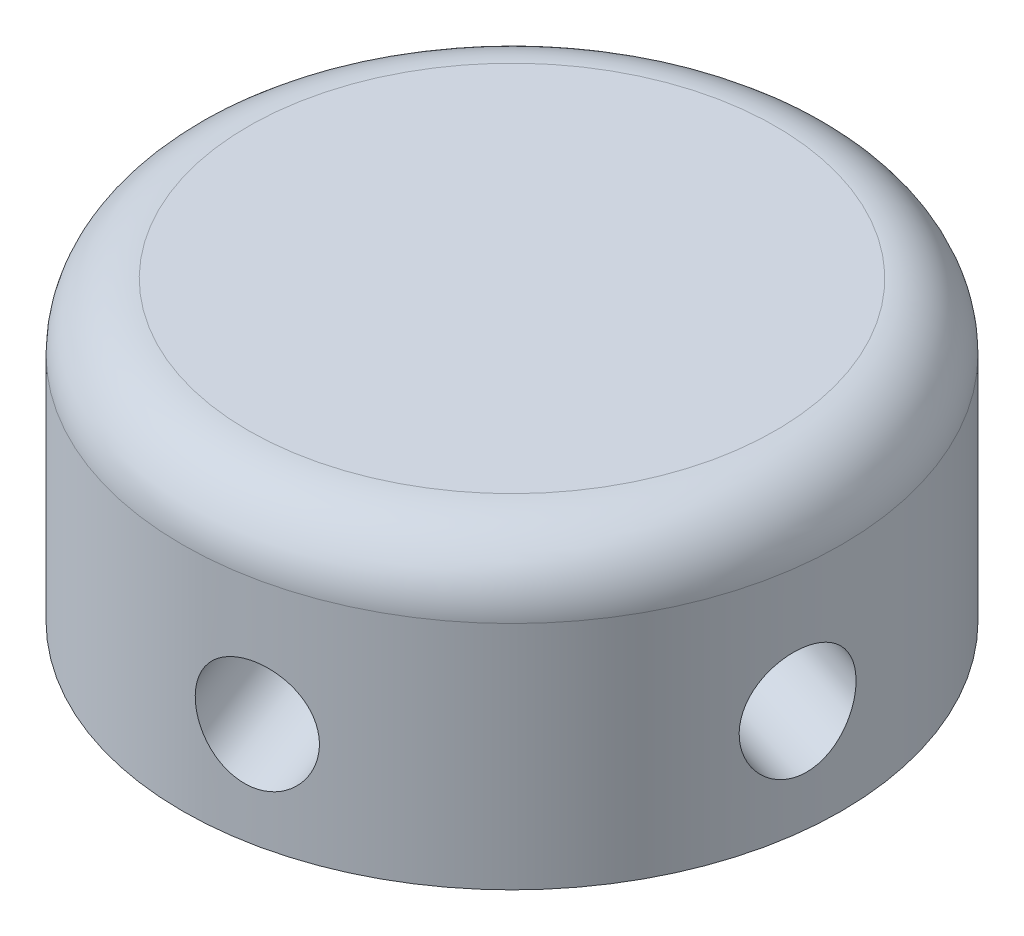
ISO-10303-21;
HEADER;
FILE_DESCRIPTION(('STEP AP214'),'2;1');
FILE_NAME('part.step','',(''),(''),'','','');
FILE_SCHEMA(('AUTOMOTIVE_DESIGN { 1 0 10303 214 1 1 1 1 }'));
ENDSEC;
DATA;
#1=APPLICATION_CONTEXT('core data for automotive mechanical design processes');
#2=APPLICATION_PROTOCOL_DEFINITION('international standard','automotive_design',2000,#1);
#3=PRODUCT_CONTEXT('',#1,'mechanical');
#4=PRODUCT('Part','Part','',(#3));
#5=PRODUCT_RELATED_PRODUCT_CATEGORY('part','',(#4));
#6=PRODUCT_DEFINITION_FORMATION('','',#4);
#7=PRODUCT_DEFINITION_CONTEXT('part definition',#1,'design');
#8=PRODUCT_DEFINITION('design','',#6,#7);
#9=PRODUCT_DEFINITION_SHAPE('','',#8);
#10=(LENGTH_UNIT() NAMED_UNIT(*) SI_UNIT(.MILLI.,.METRE.));
#11=(NAMED_UNIT(*) PLANE_ANGLE_UNIT() SI_UNIT($,.RADIAN.));
#12=(NAMED_UNIT(*) SI_UNIT($,.STERADIAN.) SOLID_ANGLE_UNIT());
#13=UNCERTAINTY_MEASURE_WITH_UNIT(LENGTH_MEASURE(1.E-05),#10,'distance_accuracy_value','');
#14=(GEOMETRIC_REPRESENTATION_CONTEXT(3) GLOBAL_UNCERTAINTY_ASSIGNED_CONTEXT((#13)) GLOBAL_UNIT_ASSIGNED_CONTEXT((#10,
#11,#12)) REPRESENTATION_CONTEXT('',''));
#15=CARTESIAN_POINT('',(0.,0.,0.));
#16=DIRECTION('',(0.,0.,1.));
#17=DIRECTION('',(1.,0.,0.));
#18=AXIS2_PLACEMENT_3D('',#15,#16,#17);
#19=CARTESIAN_POINT('',(0.,-6.,0.));
#20=DIRECTION('',(0.,1.,0.));
#21=DIRECTION('',(0.,0.,1.));
#22=AXIS2_PLACEMENT_3D('',#19,#20,#21);
#23=CYLINDRICAL_SURFACE('',#22,10.);
#24=CARTESIAN_POINT('',(0.,1.,0.));
#25=DIRECTION('',(0.,1.,0.));
#26=DIRECTION('',(0.,0.,1.));
#27=AXIS2_PLACEMENT_3D('',#24,#25,#26);
#28=CIRCLE('',#27,10.);
#29=CARTESIAN_POINT('',(0.,1.,10.));
#30=VERTEX_POINT('',#29);
#31=EDGE_CURVE('E10',#30,#30,#28,.F.);
#32=ORIENTED_EDGE('',*,*,#31,.T.);
#33=EDGE_LOOP('',(#32));
#34=FACE_BOUND('',#33,.T.);
#35=CARTESIAN_POINT('',(-6.18040658631982,-2.80419257592395,-7.8614613417465));
#36=CARTESIAN_POINT('',(-6.18041069378116,-2.90234784309518,-7.86145985033207));
#37=CARTESIAN_POINT('',(-6.18709037837394,-3.00057569421897,-7.85622071906424));
#38=CARTESIAN_POINT('',(-6.21328313433534,-3.19429375623175,-7.83552031582612));
#39=CARTESIAN_POINT('',(-6.23281569685475,-3.28977957900091,-7.82004351843738));
#40=CARTESIAN_POINT('',(-6.28376502842835,-3.47517276967888,-7.77916181257504));
#41=CARTESIAN_POINT('',(-6.31516706385408,-3.56508689335964,-7.75376921134334));
#42=CARTESIAN_POINT('',(-6.38865971296323,-3.73693258914234,-7.69332712533847));
#43=CARTESIAN_POINT('',(-6.4307480948599,-3.81886582307326,-7.65827965680337));
#44=CARTESIAN_POINT('',(-6.52448986893661,-3.97278415857681,-7.5785772815116));
#45=CARTESIAN_POINT('',(-6.57620342226979,-4.04470142029659,-7.53386164380033));
#46=CARTESIAN_POINT('',(-6.68725447470501,-4.17534392326118,-7.43546314485651));
#47=CARTESIAN_POINT('',(-6.74659001159406,-4.23407254914793,-7.38178259049963));
#48=CARTESIAN_POINT('',(-6.86747316238743,-4.33309816932697,-7.26940523116863));
#49=CARTESIAN_POINT('',(-6.92874101682425,-4.37420107240322,-7.21111983965897));
#50=CARTESIAN_POINT('',(-7.05399457373656,-4.44028699170343,-7.08863909005609));
#51=CARTESIAN_POINT('',(-7.1179783887015,-4.46528101377072,-7.02444780130276));
#52=CARTESIAN_POINT('',(-7.2408979989159,-4.4964619358335,-6.8975752553002));
#53=CARTESIAN_POINT('',(-7.2998114016746,-4.50403920222909,-6.835211852897));
#54=CARTESIAN_POINT('',(-7.41599656463583,-4.50415740699111,-6.70897494081218));
#55=CARTESIAN_POINT('',(-7.47326875792584,-4.49670234989006,-6.64510183778663));
#56=CARTESIAN_POINT('',(-7.58217917913624,-4.46774917979113,-6.52051620708892));
#57=CARTESIAN_POINT('',(-7.63395240425703,-4.44684381033082,-6.45978210248453));
#58=CARTESIAN_POINT('',(-7.73327325732892,-4.39246364343792,-6.34054506008151));
#59=CARTESIAN_POINT('',(-7.78082040703957,-4.35898742566933,-6.28204237522627));
#60=CARTESIAN_POINT('',(-7.87234067780815,-4.27943950635112,-6.1669959074082));
#61=CARTESIAN_POINT('',(-7.91614456968675,-4.23298937226029,-6.11058005058202));
#62=CARTESIAN_POINT('',(-7.99779809730484,-4.12962391405995,-6.00331398885442));
#63=CARTESIAN_POINT('',(-8.03564580230697,-4.0727052094075,-5.95246559029986));
#64=CARTESIAN_POINT('',(-8.10775604691805,-3.94529584290214,-5.85391396776607));
#65=CARTESIAN_POINT('',(-8.14151429694982,-3.87409566698231,-5.80675887231004));
#66=CARTESIAN_POINT('',(-8.20153607142322,-3.7234916320388,-5.72167140512811));
#67=CARTESIAN_POINT('',(-8.22779684344153,-3.64408477476704,-5.68374242118406));
#68=CARTESIAN_POINT('',(-8.27416487683236,-3.47360706993731,-5.61604816884507));
#69=CARTESIAN_POINT('',(-8.29374975039458,-3.38211206928312,-5.58698947660017));
#70=CARTESIAN_POINT('',(-8.32405447795391,-3.19457090082377,-5.54173833167562));
#71=CARTESIAN_POINT('',(-8.33477322064973,-3.09852416408824,-5.52554749189225));
#72=CARTESIAN_POINT('',(-8.34721005269621,-2.9032972349777,-5.50674303326532));
#73=CARTESIAN_POINT('',(-8.3488141503021,-2.80409289685924,-5.50430137103277));
#74=CARTESIAN_POINT('',(-8.34248086251898,-2.60668729118917,-5.51389588691072));
#75=CARTESIAN_POINT('',(-8.33454554272457,-2.50848581112888,-5.52592893077623));
#76=CARTESIAN_POINT('',(-8.30942286587974,-2.31961542955216,-5.56362998091201));
#77=CARTESIAN_POINT('',(-8.29257179549985,-2.22880300805648,-5.58880197157573));
#78=CARTESIAN_POINT('',(-8.24983112683427,-2.05390062311326,-5.65170093491985));
#79=CARTESIAN_POINT('',(-8.2239437144287,-1.96980903994349,-5.68942487119679));
#80=CARTESIAN_POINT('',(-8.16459239437144,-1.81433058777238,-5.77425211059514));
#81=CARTESIAN_POINT('',(-8.13148151790137,-1.74256485669541,-5.82090888833601));
#82=CARTESIAN_POINT('',(-8.05758249695944,-1.60987893076595,-5.92277904761302));
#83=CARTESIAN_POINT('',(-8.01679522194457,-1.54895750916636,-5.97799145998169));
#84=CARTESIAN_POINT('',(-7.9291356931972,-1.44084866104323,-6.09376440834493));
#85=CARTESIAN_POINT('',(-7.88240129647873,-1.39341115377824,-6.15419605110393));
#86=CARTESIAN_POINT('',(-7.78316118923601,-1.31197818446462,-6.27923276033472));
#87=CARTESIAN_POINT('',(-7.73065563818385,-1.27798235110665,-6.34383771146675));
#88=CARTESIAN_POINT('',(-7.62126393920933,-1.22444215000392,-6.47484261923763));
#89=CARTESIAN_POINT('',(-7.56439461267379,-1.20484509181928,-6.54123510023709));
#90=CARTESIAN_POINT('',(-7.44753128648001,-1.18040665367519,-6.67398645668238));
#91=CARTESIAN_POINT('',(-7.38753727259583,-1.17556534090098,-6.74034533197383));
#92=CARTESIAN_POINT('',(-7.26603697545491,-1.18076540289665,-6.87114840534427));
#93=CARTESIAN_POINT('',(-7.20452970867928,-1.1908167224365,-6.93559129467686));
#94=CARTESIAN_POINT('',(-7.08188582181877,-1.22556046932424,-7.06077720898353));
#95=CARTESIAN_POINT('',(-7.02074920150364,-1.25025288757539,-7.12152023625636));
#96=CARTESIAN_POINT('',(-6.90082161745449,-1.31362986693059,-7.23779262794899));
#97=CARTESIAN_POINT('',(-6.84203053304105,-1.3523137071329,-7.29332226080096));
#98=CARTESIAN_POINT('',(-6.72880950003165,-1.4426321301286,-7.39790984547475));
#99=CARTESIAN_POINT('',(-6.67437928718441,-1.49426592742231,-7.44696818954728));
#100=CARTESIAN_POINT('',(-6.57186287088399,-1.60901583583468,-7.53759282097776));
#101=CARTESIAN_POINT('',(-6.52377217819324,-1.67212374556233,-7.57916441768701));
#102=CARTESIAN_POINT('',(-6.43563400862007,-1.80807329481835,-7.65414747741365));
#103=CARTESIAN_POINT('',(-6.39558808462159,-1.88091680910276,-7.68755736524249));
#104=CARTESIAN_POINT('',(-6.32481099983414,-2.03460274266089,-7.74589484926247));
#105=CARTESIAN_POINT('',(-6.29412611305473,-2.11548235994557,-7.77078037939385));
#106=CARTESIAN_POINT('',(-6.24337632993539,-2.2825764910716,-7.8116145758641));
#107=CARTESIAN_POINT('',(-6.22330160238461,-2.36878598329015,-7.82757151610482));
#108=CARTESIAN_POINT('',(-6.19932412581324,-2.51357139572223,-7.84656075943516));
#109=CARTESIAN_POINT('',(-6.19222425836726,-2.57131759117338,-7.85215871739794));
#110=CARTESIAN_POINT('',(-6.18276429226737,-2.68743149130231,-7.85960943208847));
#111=CARTESIAN_POINT('',(-6.18040414275684,-2.74579918930468,-7.86146222900137));
#112=CARTESIAN_POINT('',(-6.18040658631982,-2.80419257592395,-7.8614613417465));
#113=B_SPLINE_CURVE_WITH_KNOTS('',3,(#35,#36,#37,#38,#39,#40,#41,#42,#43,#44,#45,#46,#47,#48,
#49,#50,#51,#52,#53,#54,#55,#56,#57,#58,#59,#60,#61,#62,#63,#64,#65,#66,#67,#68,#69,#70,#71,#72,
#73,#74,#75,#76,#77,#78,#79,#80,#81,#82,#83,#84,#85,#86,#87,#88,#89,#90,#91,#92,#93,#94,#95,#96,
#97,#98,#99,#100,#101,#102,#103,#104,#105,#106,#107,#108,#109,#110,#111,#112),.UNSPECIFIED.,.T.,
.F.,(4,2,2,2,2,2,2,2,2,2,2,2,2,2,2,2,2,2,2,2,2,2,2,2,2,2,2,2,2,2,2,2,2,2,2,2,2,2,4),(0.,
0.294247369480007,0.588941991186979,0.883272002128368,1.17754059429731,1.47371432417628,
1.76981195895846,2.05036159735739,2.33071935602934,2.58777759553048,2.84476736510533,
3.091142592679,3.33754566570429,3.59206194690359,3.84666056204866,4.12096676141902,
4.39537353311392,4.6879442991612,4.98055173114879,5.27681071896179,5.57300556860702,
5.85875072810492,6.1444268140438,6.41842323334606,6.69238863746758,6.9608803249332,
7.22936459513529,7.49686142113619,7.76435946509044,8.0320362152438,8.29971279908588,
8.56737559297647,8.83502215529133,9.10247815769814,9.36998573770895,9.63879501418435,
9.90735477750061,10.0824068686198,10.2574570814401),.UNSPECIFIED.);
#114=CARTESIAN_POINT('',(-6.18040658631982,-2.80419257592395,-7.8614613417465));
#115=VERTEX_POINT('',#114);
#116=EDGE_CURVE('E49',#115,#115,#113,.T.);
#117=ORIENTED_EDGE('',*,*,#116,.F.);
#118=EDGE_LOOP('',(#117));
#119=FACE_BOUND('',#118,.T.);
#120=CARTESIAN_POINT('',(5.56684336935079,-2.80419257592395,-8.30724111249428));
#121=CARTESIAN_POINT('',(5.56684068165602,-2.90234784309518,-8.30724455804975));
#122=CARTESIAN_POINT('',(5.5597938356678,-3.00057569421897,-8.31197833501099));
#123=CARTESIAN_POINT('',(5.53201257555666,-3.19429375623175,-8.33049234985681));
#124=CARTESIAN_POINT('',(5.51125737278652,-3.28977957900091,-8.34428632730922));
#125=CARTESIAN_POINT('',(5.4566323507206,-3.47517276967888,-8.38010887923268));
#126=CARTESIAN_POINT('',(5.42277878924899,-3.56508689335964,-8.40212724433727));
#127=CARTESIAN_POINT('',(5.34258447195922,-3.73693258914234,-8.45334527542134));
#128=CARTESIAN_POINT('',(5.29624632335746,-3.81886582307326,-8.48254344189732));
#129=CARTESIAN_POINT('',(5.19147705869946,-3.97278415857681,-8.54706777852483));
#130=CARTESIAN_POINT('',(5.13296959325439,-4.04470142029659,-8.58243239843604));
#131=CARTESIAN_POINT('',(5.0050703971945,-4.17534392326118,-8.65764141710136));
#132=CARTESIAN_POINT('',(4.93568146690598,-4.23407254914793,-8.69748466254382));
#133=CARTESIAN_POINT('',(4.79144929910144,-4.33309816932697,-8.77772485699988));
#134=CARTESIAN_POINT('',(4.7170837894715,-4.37420107240322,-8.81798287270117));
#135=CARTESIAN_POINT('',(4.56189219674915,-4.44028699170343,-8.89925745108069));
#136=CARTESIAN_POINT('',(4.48107056710181,-4.46528101377072,-8.94027347612491));
#137=CARTESIAN_POINT('',(4.32242335698893,-4.4964619358335,-9.01797119956537));
#138=CARTESIAN_POINT('',(4.24490699410614,-4.50403920222909,-9.05472982398652));
#139=CARTESIAN_POINT('',(4.08894536642164,-4.50415740699111,-9.12621912916599));
#140=CARTESIAN_POINT('',(4.01050035454146,-4.49670234989006,-9.16095034747861));
#141=CARTESIAN_POINT('',(3.85835720761111,-4.46774917979113,-9.2260312361227));
#142=CARTESIAN_POINT('',(3.78459683524983,-4.44684381033082,-9.25650262878254));
#143=CARTESIAN_POINT('',(3.64050383759365,-4.39246364343792,-9.31411610083902));
#144=CARTESIAN_POINT('',(3.57017160064663,-4.35898742566933,-9.34125780356576));
#145=CARTESIAN_POINT('',(3.43247458875423,-4.27943950635112,-9.39274743975472));
#146=CARTESIAN_POINT('',(3.36528377348706,-4.23298937226029,-9.41697395805344));
#147=CARTESIAN_POINT('',(3.23803535881906,-4.12962391405995,-9.46148404157961));
#148=CARTESIAN_POINT('',(3.17798007398682,-4.0727052094075,-9.48176632875859));
#149=CARTESIAN_POINT('',(3.06196862013124,-3.94529584290214,-9.51989312060143));
#150=CARTESIAN_POINT('',(3.00668958636109,-3.87409566698231,-9.53742739840558));
#151=CARTESIAN_POINT('',(2.90721884789784,-3.7234916320388,-9.56821802477057));
#152=CARTESIAN_POINT('',(2.86303121572234,-3.64408477476704,-9.58147280250344));
#153=CARTESIAN_POINT('',(2.78432164560611,-3.47360706993731,-9.60465274841332));
#154=CARTESIAN_POINT('',(2.75063312822817,-3.38211206928312,-9.61429944029751));
#155=CARTESIAN_POINT('',(2.69823205615212,-3.19457090082377,-9.62913757612075));
#156=CARTESIAN_POINT('',(2.67952137882051,-3.09852416408824,-9.63432846156183));
#157=CARTESIAN_POINT('',(2.65779408344942,-2.9032972349777,-9.64034569443597));
#158=CARTESIAN_POINT('',(2.6549762312517,-2.80409289685924,-9.64111676679244));
#159=CARTESIAN_POINT('',(2.66605825165337,-2.60668729118918,-9.63805832063582));
#160=CARTESIAN_POINT('',(2.67995450510481,-2.50848581112888,-9.63422979808496));
#161=CARTESIAN_POINT('',(2.72357366859686,-2.31961542955216,-9.62198697776265));
#162=CARTESIAN_POINT('',(2.7527209214665,-2.22880300805648,-9.61373923036864));
#163=CARTESIAN_POINT('',(2.82574898339175,-2.05390062311326,-9.59252728752533));
#164=CARTESIAN_POINT('',(2.86962622918195,-1.96980903994349,-9.57956423267128));
#165=CARTESIAN_POINT('',(2.96864229450736,-1.81433058777238,-9.54933083154011));
#166=CARTESIAN_POINT('',(3.02324735053505,-1.74256485669541,-9.5322582539377));
#167=CARTESIAN_POINT('',(3.1429676826702,-1.60987893076595,-9.49345571895933));
#168=CARTESIAN_POINT('',(3.20808176836764,-1.54895750916636,-9.47172628899688));
#169=CARTESIAN_POINT('',(3.34527666942103,-1.44084866104323,-9.42413293149946));
#170=CARTESIAN_POINT('',(3.41719229986527,-1.39341115377824,-9.39836028357576));
#171=CARTESIAN_POINT('',(3.56677615661691,-1.31197818446462,-9.34261580097778));
#172=CARTESIAN_POINT('',(3.64444422395009,-1.27798235110665,-9.31264408232851));
#173=CARTESIAN_POINT('',(3.80284118917892,-1.22444215000392,-9.24908913703792));
#174=CARTESIAN_POINT('',(3.88355777922459,-1.20484509181928,-9.21551959838653));
#175=CARTESIAN_POINT('',(4.04592457563197,-1.18040665367519,-9.14539839566193));
#176=CARTESIAN_POINT('',(4.12757478624289,-1.17556534090098,-9.10884671801134));
#177=CARTESIAN_POINT('',(4.28952155816144,-1.18076540289665,-9.03371344127161));
#178=CARTESIAN_POINT('',(4.36981717870131,-1.1908167224365,-8.99513050237554));
#179=CARTESIAN_POINT('',(4.52677510354713,-1.22556046932424,-8.91717380957021));
#180=CARTESIAN_POINT('',(4.60343741011047,-1.25025288757539,-8.87780005615232));
#181=CARTESIAN_POINT('',(4.75107868746049,-1.31362986693059,-8.79967229086849));
#182=CARTESIAN_POINT('',(4.82205795083332,-1.3523137071329,-8.76091824717969));
#183=CARTESIAN_POINT('',(4.95651387808148,-1.4426321301286,-8.68555798701926));
#184=CARTESIAN_POINT('',(5.01999099666755,-1.49426592742231,-8.64895164044187));
#185=CARTESIAN_POINT('',(5.1378594577656,-1.60901583583468,-8.57945728591311));
#186=CARTESIAN_POINT('',(5.19225723702143,-1.67212374556233,-8.54656664912289));
#187=CARTESIAN_POINT('',(5.29080655683742,-1.80807329481835,-8.48591330836175));
#188=CARTESIAN_POINT('',(5.3349561194367,-1.88091680910276,-8.45815159451121));
#189=CARTESIAN_POINT('',(5.41230968576981,-2.03460274266089,-8.40886586079098));
#190=CARTESIAN_POINT('',(5.44545938284803,-2.11548235994557,-8.38737285099227));
#191=CARTESIAN_POINT('',(5.49997755693345,-2.2825764910716,-8.35172539971701));
#192=CARTESIAN_POINT('',(5.52135694090016,-2.36878598329015,-8.3375641649796));
#193=CARTESIAN_POINT('',(5.54682623225177,-2.51357139572223,-8.32062822854148));
#194=CARTESIAN_POINT('',(5.55434418634884,-2.57131759117338,-8.31560571748645));
#195=CARTESIAN_POINT('',(5.5643535273974,-2.68743149130231,-8.30891115254283));
#196=CARTESIAN_POINT('',(5.56684496828281,-2.74579918930467,-8.30723906270461));
#197=CARTESIAN_POINT('',(5.56684336935079,-2.80419257592395,-8.30724111249428));
#198=B_SPLINE_CURVE_WITH_KNOTS('',3,(#120,#121,#122,#123,#124,#125,#126,#127,#128,#129,#130,
#131,#132,#133,#134,#135,#136,#137,#138,#139,#140,#141,#142,#143,#144,#145,#146,#147,#148,#149,
#150,#151,#152,#153,#154,#155,#156,#157,#158,#159,#160,#161,#162,#163,#164,#165,#166,#167,#168,
#169,#170,#171,#172,#173,#174,#175,#176,#177,#178,#179,#180,#181,#182,#183,#184,#185,#186,#187,
#188,#189,#190,#191,#192,#193,#194,#195,#196,#197),.UNSPECIFIED.,.T.,.F.,(4,2,2,2,2,2,2,2,2,2,2,
2,2,2,2,2,2,2,2,2,2,2,2,2,2,2,2,2,2,2,2,2,2,2,2,2,2,2,4),(0.,0.294247369480007,
0.588941991186979,0.883272002128369,1.17754059429731,1.47371432417628,1.76981195895846,
2.05036159735739,2.33071935602934,2.58777759553048,2.84476736510533,3.091142592679,
3.33754566570429,3.59206194690359,3.84666056204865,4.12096676141902,4.39537353311392,
4.6879442991612,4.98055173114879,5.27681071896179,5.57300556860702,5.85875072810493,
6.1444268140438,6.41842323334606,6.69238863746758,6.9608803249332,7.22936459513529,
7.49686142113619,7.76435946509044,8.0320362152438,8.29971279908588,8.56737559297647,
8.83502215529133,9.10247815769814,9.36998573770895,9.63879501418435,9.90735477750061,
10.0824068686198,10.2574570814401),.UNSPECIFIED.);
#199=CARTESIAN_POINT('',(5.56684336935079,-2.80419257592395,-8.30724111249428));
#200=VERTEX_POINT('',#199);
#201=EDGE_CURVE('E57',#200,#200,#198,.T.);
#202=ORIENTED_EDGE('',*,*,#201,.F.);
#203=EDGE_LOOP('',(#202));
#204=FACE_BOUND('',#203,.T.);
#205=CARTESIAN_POINT('',(9.92735308998561,-4.50322630338943,1.20318769390029));
#206=CARTESIAN_POINT('',(9.93747158086751,-4.50611583843854,1.11968976236709));
#207=CARTESIAN_POINT('',(9.94656365977674,-4.50178304837939,1.03576684298313));
#208=CARTESIAN_POINT('',(9.9624661113616,-4.47884815399744,0.869629076678414));
#209=CARTESIAN_POINT('',(9.96927428677865,-4.46023236479396,0.787415945583453));
#210=CARTESIAN_POINT('',(9.98062867071901,-4.40963627823444,0.627282609305299));
#211=CARTESIAN_POINT('',(9.98518021682377,-4.37768784959331,0.549352665483974));
#212=CARTESIAN_POINT('',(9.99229678886943,-4.30173146568903,0.399548007862778));
#213=CARTESIAN_POINT('',(9.99486174569541,-4.25772309092354,0.327673504813696));
#214=CARTESIAN_POINT('',(9.99846782325065,-4.15722061048359,0.188834448148186));
#215=CARTESIAN_POINT('',(9.99944461795647,-4.10030129130652,0.122176792796474));
#216=CARTESIAN_POINT('',(10.000191736081,-3.97687044676209,-0.00157118390889282));
#217=CARTESIAN_POINT('',(9.99996165377224,-3.91035570291724,-0.0586582811790618));
#218=CARTESIAN_POINT('',(9.99877298805763,-3.76384268192975,-0.166355199607757));
#219=CARTESIAN_POINT('',(9.99775735406143,-3.68319042631406,-0.216075988456209));
#220=CARTESIAN_POINT('',(9.99553162089881,-3.51496774271233,-0.301993473386273));
#221=CARTESIAN_POINT('',(9.994321459765,-3.42739511474905,-0.338185847680939));
#222=CARTESIAN_POINT('',(9.99214475836298,-3.24336619318965,-0.397457240081453));
#223=CARTESIAN_POINT('',(9.99119221933799,-3.1466860486199,-0.419845630271941));
#224=CARTESIAN_POINT('',(9.98997443116463,-2.95091352349595,-0.447898162480002));
#225=CARTESIAN_POINT('',(9.98970915334956,-2.85182124372955,-0.453563002063254));
#226=CARTESIAN_POINT('',(9.98997568776477,-2.65525702638746,-0.447654862845942));
#227=CARTESIAN_POINT('',(9.99049850373749,-2.55777945013346,-0.436276445782735));
#228=CARTESIAN_POINT('',(9.99215335482241,-2.36634287483814,-0.396564915311679));
#229=CARTESIAN_POINT('',(9.99328522731719,-2.27238294374863,-0.368236327354412));
#230=CARTESIAN_POINT('',(9.99565636177197,-2.09496299673918,-0.29675815295416));
#231=CARTESIAN_POINT('',(9.99688892730428,-2.01122538412609,-0.254297055812373));
#232=CARTESIAN_POINT('',(9.99891334558655,-1.85241205398823,-0.15544858565793));
#233=CARTESIAN_POINT('',(9.99970528156228,-1.77733470284466,-0.0990638454394953));
#234=CARTESIAN_POINT('',(10.0001535387467,-1.64051789357053,0.0238823714026653));
#235=CARTESIAN_POINT('',(9.99984675535424,-1.57841786272032,0.0900429836730085));
#236=CARTESIAN_POINT('',(9.99756202838942,-1.46630729881969,0.23189170496111));
#237=CARTESIAN_POINT('',(9.99558420163241,-1.4162959210183,0.307579147684775));
#238=CARTESIAN_POINT('',(9.9894764346614,-1.33027339058666,0.465306593080012));
#239=CARTESIAN_POINT('',(9.98537168516191,-1.2941067981997,0.547262868864093));
#240=CARTESIAN_POINT('',(9.97469882670128,-1.23592461440921,0.715901872032833));
#241=CARTESIAN_POINT('',(9.96813073798167,-1.21390890673034,0.802584560575034));
#242=CARTESIAN_POINT('',(9.95243946460123,-1.18461552438532,0.978112721952867));
#243=CARTESIAN_POINT('',(9.94331817823612,-1.17732693310918,1.0669565433517));
#244=CARTESIAN_POINT('',(9.92268067853598,-1.17764248148586,1.24433950491424));
#245=CARTESIAN_POINT('',(9.9111644558854,-1.18524667906793,1.33287864389147));
#246=CARTESIAN_POINT('',(9.88615666531998,-1.21516102778183,1.50720523339001));
#247=CARTESIAN_POINT('',(9.87266392129036,-1.23747996268658,1.59299100823057));
#248=CARTESIAN_POINT('',(9.8443798474004,-1.29624869601392,1.75934922279337));
#249=CARTESIAN_POINT('',(9.82958853329444,-1.33269832301985,1.83992172574296));
#250=CARTESIAN_POINT('',(9.79958146819504,-1.41872943258444,1.99357342171471));
#251=CARTESIAN_POINT('',(9.78436595790433,-1.46830359828222,2.06665675851568));
#252=CARTESIAN_POINT('',(9.75448615573963,-1.57922779388592,2.20338517182545));
#253=CARTESIAN_POINT('',(9.73982184666737,-1.64057745601468,2.26703054299466));
#254=CARTESIAN_POINT('',(9.71204281917471,-1.77334593453038,2.3832340763728));
#255=CARTESIAN_POINT('',(9.69892869479173,-1.84476858808605,2.43578799430921));
#256=CARTESIAN_POINT('',(9.67517431857508,-1.99561388433194,2.52849769883648));
#257=CARTESIAN_POINT('',(9.66453409775658,-2.07503662730087,2.5686533299929));
#258=CARTESIAN_POINT('',(9.64636774595636,-2.24043354768507,2.63606282413499));
#259=CARTESIAN_POINT('',(9.63887350834762,-2.32646483157541,2.66318493730356));
#260=CARTESIAN_POINT('',(9.62763461524281,-2.50195468590873,2.7035333093719));
#261=CARTESIAN_POINT('',(9.62389048520026,-2.59141373481684,2.71675762096731));
#262=CARTESIAN_POINT('',(9.62028554157676,-2.77404457649806,2.72949698535217));
#263=CARTESIAN_POINT('',(9.62054338150975,-2.86724772045195,2.72859315038128));
#264=CARTESIAN_POINT('',(9.62512160451679,-3.05229313121454,2.71239749907065));
#265=CARTESIAN_POINT('',(9.62944296169443,-3.14413506635284,2.69710223282622));
#266=CARTESIAN_POINT('',(9.64203841119566,-3.32803733023408,2.65173003156967));
#267=CARTESIAN_POINT('',(9.65047469065912,-3.41993678405649,2.62104497712594));
#268=CARTESIAN_POINT('',(9.67069145979926,-3.59730393228497,2.54543724825957));
#269=CARTESIAN_POINT('',(9.68247270396796,-3.68277017010274,2.50051136140061));
#270=CARTESIAN_POINT('',(9.70881886923832,-3.84670132949995,2.39620308017121));
#271=CARTESIAN_POINT('',(9.72344054533483,-3.92496503751464,2.33651768067541));
#272=CARTESIAN_POINT('',(9.75422250490331,-4.06967581198045,2.20447803636209));
#273=CARTESIAN_POINT('',(9.77038291520708,-4.13612190305521,2.13212274680237));
#274=CARTESIAN_POINT('',(9.80248646043133,-4.25247409998337,1.97917783489853));
#275=CARTESIAN_POINT('',(9.81841739257082,-4.3028778508246,1.8989652082616));
#276=CARTESIAN_POINT('',(9.84949876089979,-4.38788221630196,1.73050781058989));
#277=CARTESIAN_POINT('',(9.8646505948503,-4.42251207536418,1.64227827016818));
#278=CARTESIAN_POINT('',(9.88779604627379,-4.46447792520214,1.49492175671137));
#279=CARTESIAN_POINT('',(9.89633516158305,-4.47718169552662,1.43735988808217));
#280=CARTESIAN_POINT('',(9.91253806276659,-4.49553453526019,1.32099860608937));
#281=CARTESIAN_POINT('',(9.92020191554303,-4.50118414419441,1.26219928771976));
#282=CARTESIAN_POINT('',(9.92735308998561,-4.50322630338943,1.20318769390029));
#283=B_SPLINE_CURVE_WITH_KNOTS('',3,(#205,#206,#207,#208,#209,#210,#211,#212,#213,#214,#215,
#216,#217,#218,#219,#220,#221,#222,#223,#224,#225,#226,#227,#228,#229,#230,#231,#232,#233,#234,
#235,#236,#237,#238,#239,#240,#241,#242,#243,#244,#245,#246,#247,#248,#249,#250,#251,#252,#253,
#254,#255,#256,#257,#258,#259,#260,#261,#262,#263,#264,#265,#266,#267,#268,#269,#270,#271,#272,
#273,#274,#275,#276,#277,#278,#279,#280,#281,#282),.UNSPECIFIED.,.T.,.F.,(4,2,2,2,2,2,2,2,2,2,2,
2,2,2,2,2,2,2,2,2,2,2,2,2,2,2,2,2,2,2,2,2,2,2,2,2,2,2,4),(0.,0.252248403203044,0.50473879386721,
0.756629088117827,1.00852814542465,1.27039654907248,1.53235299318959,1.8153580038218,
2.09845334611585,2.39475726963461,2.69104883367463,2.98398368367868,3.27684035918863,
3.55712444850328,3.83735557997979,4.10826598771179,4.37915745884014,4.6469115111212,
4.9146633632858,5.18221666901757,5.44977101546732,5.71748521982135,5.98519617668867,
6.25275819925242,6.5203118665682,6.78796773148794,7.05562695181105,7.325937691841,
7.59628630168278,7.87466534218203,8.15311113253284,8.44354639949903,8.73404722931547,
9.03109548314861,9.32816824272804,9.6148399080652,9.9009779057113,10.0792663817537,
10.2575412208797),.UNSPECIFIED.);
#284=CARTESIAN_POINT('',(9.92735308998561,-4.50322630338943,1.20318769390029));
#285=VERTEX_POINT('',#284);
#286=EDGE_CURVE('E91',#285,#285,#283,.T.);
#287=ORIENTED_EDGE('',*,*,#286,.F.);
#288=EDGE_LOOP('',(#287));
#289=FACE_BOUND('',#288,.T.);
#290=CARTESIAN_POINT('',(1.8869488312424,-1.17988271041713,9.820357636475));
#291=CARTESIAN_POINT('',(1.79945112973037,-1.18475788519567,9.83716851436081));
#292=CARTESIAN_POINT('',(1.71207388780583,-1.1970615964251,9.85273427537302));
#293=CARTESIAN_POINT('',(1.54011446951967,-1.23623501154644,9.88107607464319));
#294=CARTESIAN_POINT('',(1.45553513038818,-1.26311904764654,9.8938493505731));
#295=CARTESIAN_POINT('',(1.29172968985668,-1.33074121411888,9.91656548624668));
#296=CARTESIAN_POINT('',(1.21250170286714,-1.37147443377837,9.92650934696596));
#297=CARTESIAN_POINT('',(1.06173684355278,-1.46568816415508,9.94376591611577));
#298=CARTESIAN_POINT('',(0.990198215564106,-1.51916575601907,9.95107922606232));
#299=CARTESIAN_POINT('',(0.856928562793338,-1.63736917986167,9.96344117134831));
#300=CARTESIAN_POINT('',(0.795194342733254,-1.70209133275477,9.96849054549149));
#301=CARTESIAN_POINT('',(0.68328916963773,-1.84095631188058,9.97678675316516));
#302=CARTESIAN_POINT('',(0.633118430497758,-1.91509931233605,9.98003355335411));
#303=CARTESIAN_POINT('',(0.545463334213141,-2.07109010181131,9.98520987540477));
#304=CARTESIAN_POINT('',(0.508047312370339,-2.15297648026065,9.98713235637642));
#305=CARTESIAN_POINT('',(0.447138725622041,-2.32178014588872,9.99004511315271));
#306=CARTESIAN_POINT('',(0.423647416805992,-2.40869788614929,9.99103530486424));
#307=CARTESIAN_POINT('',(0.390591417550573,-2.58715311039519,9.99238320734883));
#308=CARTESIAN_POINT('',(0.381350410993514,-2.67875046191643,9.9927262563929));
#309=CARTESIAN_POINT('',(0.377720989293566,-2.86223482854569,9.99286381786895));
#310=CARTESIAN_POINT('',(0.383335721731672,-2.95412190091889,9.99265821405422));
#311=CARTESIAN_POINT('',(0.409498262249908,-3.13958461146535,9.99162097134035));
#312=CARTESIAN_POINT('',(0.430648645751802,-3.23307511652322,9.9907640208221));
#313=CARTESIAN_POINT('',(0.487770991347369,-3.41541140782257,9.98813748471376));
#314=CARTESIAN_POINT('',(0.523746946708113,-3.50425593539916,9.98636765320688));
#315=CARTESIAN_POINT('',(0.61102164830908,-3.67793018914257,9.98141395066469));
#316=CARTESIAN_POINT('',(0.662807753092569,-3.76251443694909,9.97818324657079));
#317=CARTESIAN_POINT('',(0.779887302249498,-3.92167683340661,9.96971466213185));
#318=CARTESIAN_POINT('',(0.845181587810698,-3.99625435843725,9.96447665676988));
#319=CARTESIAN_POINT('',(0.986696434114059,-4.13189888314325,9.95145224670999));
#320=CARTESIAN_POINT('',(1.06275908429531,-4.19313332764407,9.94370088320829));
#321=CARTESIAN_POINT('',(1.22439088781583,-4.30081455654523,9.92509236242018));
#322=CARTESIAN_POINT('',(1.30995475224262,-4.34726951292676,9.91423692778642));
#323=CARTESIAN_POINT('',(1.48149520274686,-4.42039515155083,9.89000123370738));
#324=CARTESIAN_POINT('',(1.56700117290235,-4.44824673456581,9.87685818054688));
#325=CARTESIAN_POINT('',(1.74117212114859,-4.48785940730089,9.8476440814622));
#326=CARTESIAN_POINT('',(1.82983527128239,-4.49962965729237,9.83157470834974));
#327=CARTESIAN_POINT('',(2.00061640842381,-4.50620850746607,9.79819054534492));
#328=CARTESIAN_POINT('',(2.08272613451838,-4.50222396319129,9.78105977801961));
#329=CARTESIAN_POINT('',(2.24465436031334,-4.48016765933825,9.7451732958157));
#330=CARTESIAN_POINT('',(2.3244730679195,-4.46209718225012,9.72641772900934));
#331=CARTESIAN_POINT('',(2.4786521356151,-4.41300188845494,9.68826715227286));
#332=CARTESIAN_POINT('',(2.55306887208699,-4.38214423029697,9.66888326539049));
#333=CARTESIAN_POINT('',(2.69584433373164,-4.30871265039763,9.63005220169523));
#334=CARTESIAN_POINT('',(2.7642017989999,-4.26613629950782,9.61060501258733));
#335=CARTESIAN_POINT('',(2.89714975163433,-4.16803837314638,9.57139471127444));
#336=CARTESIAN_POINT('',(2.96131666972515,-4.11192663970629,9.55167460859289));
#337=CARTESIAN_POINT('',(3.08028130015328,-3.99002612270598,9.51397759575605));
#338=CARTESIAN_POINT('',(3.13507556550246,-3.92423379538252,9.49600132797994));
#339=CARTESIAN_POINT('',(3.23839582013824,-3.77916184450483,9.46128964444992));
#340=CARTESIAN_POINT('',(3.28607166204278,-3.69922470291531,9.4447679979217));
#341=CARTESIAN_POINT('',(3.36861333681781,-3.53231996698333,9.41564471149395));
#342=CARTESIAN_POINT('',(3.40347519681208,-3.44535020240932,9.40304428752458));
#343=CARTESIAN_POINT('',(3.46100545316147,-3.26225642729358,9.38202713505441));
#344=CARTESIAN_POINT('',(3.48300099583673,-3.16589303513736,9.37384277009261));
#345=CARTESIAN_POINT('',(3.51136017725102,-2.97057074708831,9.36325710649527));
#346=CARTESIAN_POINT('',(3.51772416167656,-2.87161190864178,9.36085567997208));
#347=CARTESIAN_POINT('',(3.51433178540988,-2.6749381347884,9.36212990295936));
#348=CARTESIAN_POINT('',(3.50472924620439,-2.57722036376153,9.36574756478833));
#349=CARTESIAN_POINT('',(3.46954388654891,-2.38510669647371,9.37883870164833));
#350=CARTESIAN_POINT('',(3.44396531298001,-2.29070992443957,9.38831062044557));
#351=CARTESIAN_POINT('',(3.37861378028614,-2.1122239181654,9.41201963799943));
#352=CARTESIAN_POINT('',(3.33949209244676,-2.02786686659047,9.42603649247039));
#353=CARTESIAN_POINT('',(3.24775543901786,-1.86767474776899,9.45803536700821));
#354=CARTESIAN_POINT('',(3.19514350676156,-1.79183777025694,9.47601649556559));
#355=CARTESIAN_POINT('',(3.07977465382465,-1.65347380868961,9.51412324241499));
#356=CARTESIAN_POINT('',(3.01742430032603,-1.59058146667273,9.53415496109062));
#357=CARTESIAN_POINT('',(2.88299644381022,-1.47678152203921,9.57566018822197));
#358=CARTESIAN_POINT('',(2.81091766961876,-1.42587548801578,9.5971338849107));
#359=CARTESIAN_POINT('',(2.6599187612638,-1.33802625594269,9.64006834607164));
#360=CARTESIAN_POINT('',(2.58108928316139,-1.30092554630175,9.66152627940089));
#361=CARTESIAN_POINT('',(2.41807071745498,-1.24086915211944,9.70360732041632));
#362=CARTESIAN_POINT('',(2.33388706771279,-1.21789936112565,9.72423124138736));
#363=CARTESIAN_POINT('',(2.18892071746701,-1.19146477335558,9.75768152617976));
#364=CARTESIAN_POINT('',(2.12890975904827,-1.18417271969729,9.77095423583315));
#365=CARTESIAN_POINT('',(2.00822954382959,-1.17669311347785,9.79646967199437));
#366=CARTESIAN_POINT('',(1.94756028556266,-1.17650557675206,9.8087123962064));
#367=CARTESIAN_POINT('',(1.8869488312424,-1.17988271041713,9.820357636475));
#368=B_SPLINE_CURVE_WITH_KNOTS('',3,(#290,#291,#292,#293,#294,#295,#296,#297,#298,#299,#300,
#301,#302,#303,#304,#305,#306,#307,#308,#309,#310,#311,#312,#313,#314,#315,#316,#317,#318,#319,
#320,#321,#322,#323,#324,#325,#326,#327,#328,#329,#330,#331,#332,#333,#334,#335,#336,#337,#338,
#339,#340,#341,#342,#343,#344,#345,#346,#347,#348,#349,#350,#351,#352,#353,#354,#355,#356,#357,
#358,#359,#360,#361,#362,#363,#364,#365,#366,#367),.UNSPECIFIED.,.T.,.F.,(4,2,2,2,2,2,2,2,2,2,2,
2,2,2,2,2,2,2,2,2,2,2,2,2,2,2,2,2,2,2,2,2,2,2,2,2,2,2,4),(0.,0.267469811619867,
0.535203019253906,0.802841391544759,1.07041852522662,1.33790827518966,1.60540297264682,
1.87430908120209,2.14323944294974,2.41819277890536,2.69320437565799,2.97948684341757,
3.26584647179837,3.56211992190501,3.85841182724718,4.15073869864069,4.4429036524975,
4.71409391774852,4.98512964272775,5.23582093139192,5.48648939788596,5.73397953571808,
5.98152101405834,6.24288684630809,6.50434859557287,6.78669252311201,7.06912391551495,
7.36524356240143,7.6613566606451,7.95463350173544,8.24783241472102,8.52853798326313,
8.80918048934631,9.08026442131184,9.35138380909724,9.61930742364079,9.88696314259754,
10.0722445597595,10.2575263898977),.UNSPECIFIED.);
#369=CARTESIAN_POINT('',(1.8869488312424,-1.17988271041713,9.820357636475));
#370=VERTEX_POINT('',#369);
#371=EDGE_CURVE('E97',#370,#370,#368,.T.);
#372=ORIENTED_EDGE('',*,*,#371,.F.);
#373=EDGE_LOOP('',(#372));
#374=FACE_BOUND('',#373,.T.);
#375=CARTESIAN_POINT('',(-9.38654470399012,-2.80419257592395,3.44859080205164));
#376=CARTESIAN_POINT('',(-9.38654455484606,-2.90234784309518,3.44859516935191));
#377=CARTESIAN_POINT('',(-9.38362598097031,-3.00057569421897,3.45656690750819));
#378=CARTESIAN_POINT('',(-9.37203273430235,-3.19429375623175,3.487874475136));
#379=CARTESIAN_POINT('',(-9.36334931905659,-3.28977957900091,3.51123363941165));
#380=CARTESIAN_POINT('',(-9.34021271560724,-3.47517276967888,3.57232247507611));
#381=CARTESIAN_POINT('',(-9.32576667934466,-3.56508689335964,3.61003433080466));
#382=CARTESIAN_POINT('',(-9.29099331712761,-3.73693258914234,3.69860762539069));
#383=CARTESIAN_POINT('',(-9.27066721906947,-3.81886582307326,3.74946631864099));
#384=CARTESIAN_POINT('',(-9.22383355695659,-3.97278415857681,3.86324943218292));
#385=CARTESIAN_POINT('',(-9.19728682515046,-4.04470142029659,3.92624983602832));
#386=CARTESIAN_POINT('',(-9.13802095398199,-4.17534392326119,4.0622724714829));
#387=CARTESIAN_POINT('',(-9.10530340223162,-4.23407254914793,4.13529212405285));
#388=CARTESIAN_POINT('',(-9.03578113028456,-4.33309816932697,4.28498534614143));
#389=CARTESIAN_POINT('',(-8.99928123711436,-4.37420107240322,4.36126571484327));
#390=CARTESIAN_POINT('',(-8.92150059977564,-4.44028699170343,4.51823755944494));
#391=CARTESIAN_POINT('',(-8.88022314250651,-4.46528101377073,4.59892598272038));
#392=CARTESIAN_POINT('',(-8.79754442939001,-4.4964619358335,4.75503525182965));
#393=CARTESIAN_POINT('',(-8.75643855180501,-4.5040392022291,4.83033657859006));
#394=CARTESIAN_POINT('',(-8.672283303819,-4.50415740699111,4.97984458607279));
#395=CARTESIAN_POINT('',(-8.6292344540023,-4.49670234989006,5.05405155302212));
#396=CARTESIAN_POINT('',(-8.54440164910905,-4.46774917979113,5.19613059594724));
#397=CARTESIAN_POINT('',(-8.50263888957961,-4.44684381033082,5.26413772952888));
#398=CARTESIAN_POINT('',(-8.41992955491349,-4.39246364343792,5.39544374650843));
#399=CARTESIAN_POINT('',(-8.37898307255584,-4.35898742566933,5.45874209690884));
#400=CARTESIAN_POINT('',(-8.29784869865801,-4.27943950635112,5.58133436049499));
#401=CARTESIAN_POINT('',(-8.25773017741134,-4.23298937226029,5.64042779581673));
#402=CARTESIAN_POINT('',(-8.18094641811264,-4.12962391405996,5.7512319513299));
#403=CARTESIAN_POINT('',(-8.1442823013679,-4.0727052094075,5.80294027708911));
#404=CARTESIAN_POINT('',(-8.07283742961904,-3.94529584290214,5.90197532130427));
#405=CARTESIAN_POINT('',(-8.03842214176924,-3.87409566698231,5.948653050843));
#406=CARTESIAN_POINT('',(-7.97604689999563,-3.7234916320388,6.03203062394306));
#407=CARTESIAN_POINT('',(-7.94808931749826,-3.64408477476704,6.0687268029121));
#408=CARTESIAN_POINT('',(-7.89803676800905,-3.47360706993731,6.13374409761049));
#409=CARTESIAN_POINT('',(-7.87645236815793,-3.38211206928312,6.16135004897064));
#410=CARTESIAN_POINT('',(-7.84278064773336,-3.19457090082377,6.20415493038711));
#411=CARTESIAN_POINT('',(-7.83069451770443,-3.09852416408824,6.21935230512072));
#412=CARTESIAN_POINT('',(-7.81665360725043,-2.9032972349777,6.23699133256634));
#413=CARTESIAN_POINT('',(-7.81482714189443,-2.80409289685925,6.23927143517157));
#414=CARTESIAN_POINT('',(-7.8219949751856,-2.60668729118918,6.23028325209678));
#415=CARTESIAN_POINT('',(-7.83098693129249,-2.50848581112889,6.21901789944892));
#416=CARTESIAN_POINT('',(-7.85907942660605,-2.31961542955216,6.18347454873112));
#417=CARTESIAN_POINT('',(-7.8778121452341,-2.22880300805648,6.15966965554244));
#418=CARTESIAN_POINT('',(-7.92442502122213,-2.05390062311326,6.09958401549534));
#419=CARTESIAN_POINT('',(-7.9523029662649,-1.96980903994349,6.0633062858327));
#420=CARTESIAN_POINT('',(-8.01463789851775,-1.81433058777238,5.98064676758153));
#421=CARTESIAN_POINT('',(-8.04877930748964,-1.74256485669541,5.93473871552971));
#422=CARTESIAN_POINT('',(-8.12282753294734,-1.60987893076595,5.83297695967879));
#423=CARTESIAN_POINT('',(-8.1627336963771,-1.54895750916636,5.77712438227162));
#424=CARTESIAN_POINT('',(-8.24575202922682,-1.44084866104323,5.65797940770794));
#425=CARTESIAN_POINT('',(-8.28878421405532,-1.39341115377824,5.59485795056319));
#426=CARTESIAN_POINT('',(-8.37703431148377,-1.31197818446462,5.46183653181914));
#427=CARTESIAN_POINT('',(-8.42225216366868,-1.27798235110665,5.39193675752875));
#428=CARTESIAN_POINT('',(-8.51304134084415,-1.22444215000392,5.2474163265427));
#429=CARTESIAN_POINT('',(-8.55861075417355,-1.20484509181928,5.17281397803622));
#430=CARTESIAN_POINT('',(-8.6487520429548,-1.18040665367519,5.02064792497577));
#431=CARTESIAN_POINT('',(-8.69332391386377,-1.17556534090098,4.94308420693986));
#432=CARTESIAN_POINT('',(-8.78017937250602,-1.18076540289665,4.78711018502425));
#433=CARTESIAN_POINT('',(-8.82246141162344,-1.1908167224365,4.70869935018739));
#434=CARTESIAN_POINT('',(-8.90362124587707,-1.22556046932424,4.55337350742781));
#435=CARTESIAN_POINT('',(-8.94249904312836,-1.25025288757539,4.47645849857575));
#436=CARTESIAN_POINT('',(-9.01602099734735,-1.31362986693059,4.32647044327263));
#437=CARTESIAN_POINT('',(-9.05066537231721,-1.3523137071329,4.25339719909851));
#438=CARTESIAN_POINT('',(-9.11514685292419,-1.4426321301286,4.11339825680843));
#439=CARTESIAN_POINT('',(-9.14498424995578,-1.49426592742231,4.04647218616243));
#440=CARTESIAN_POINT('',(-9.19949408137533,-1.60901583583468,3.9209687291917));
#441=CARTESIAN_POINT('',(-9.22417017800576,-1.67212374556233,3.86238543266855));
#442=CARTESIAN_POINT('',(-9.26824711331932,-1.80807329481835,3.75539001241589));
#443=CARTESIAN_POINT('',(-9.28764693377664,-1.88091680910276,3.70697985232681));
#444=CARTESIAN_POINT('',(-9.32125785608648,-2.03460274266089,3.62163957066408));
#445=CARTESIAN_POINT('',(-9.33544325019408,-2.11548235994557,3.58476645741611));
#446=CARTESIAN_POINT('',(-9.35859633339007,-2.2825764910716,3.52388208481895));
#447=CARTESIAN_POINT('',(-9.3675688534155,-2.36878598329015,3.49985891865632));
#448=CARTESIAN_POINT('',(-9.37821924928155,-2.51357139572223,3.47118698441941));
#449=CARTESIAN_POINT('',(-9.38134924398139,-2.57131759117338,3.46270474507578));
#450=CARTESIAN_POINT('',(-9.3855120044478,-2.68743149130231,3.45140538521294));
#451=CARTESIAN_POINT('',(-9.38654479271716,-2.74579918930467,3.4485882039083));
#452=CARTESIAN_POINT('',(-9.38654470399012,-2.80419257592395,3.44859080205164));
#453=B_SPLINE_CURVE_WITH_KNOTS('',3,(#375,#376,#377,#378,#379,#380,#381,#382,#383,#384,#385,
#386,#387,#388,#389,#390,#391,#392,#393,#394,#395,#396,#397,#398,#399,#400,#401,#402,#403,#404,
#405,#406,#407,#408,#409,#410,#411,#412,#413,#414,#415,#416,#417,#418,#419,#420,#421,#422,#423,
#424,#425,#426,#427,#428,#429,#430,#431,#432,#433,#434,#435,#436,#437,#438,#439,#440,#441,#442,
#443,#444,#445,#446,#447,#448,#449,#450,#451,#452),.UNSPECIFIED.,.T.,.F.,(4,2,2,2,2,2,2,2,2,2,2,
2,2,2,2,2,2,2,2,2,2,2,2,2,2,2,2,2,2,2,2,2,2,2,2,2,2,2,4),(0.,0.294247369480007,
0.588941991186979,0.883272002128369,1.17754059429731,1.47371432417628,1.76981195895846,
2.05036159735739,2.33071935602934,2.58777759553048,2.84476736510533,3.091142592679,
3.33754566570429,3.59206194690359,3.84666056204865,4.12096676141902,4.39537353311392,
4.6879442991612,4.98055173114879,5.27681071896179,5.57300556860702,5.85875072810492,
6.1444268140438,6.41842323334606,6.69238863746758,6.9608803249332,7.22936459513529,
7.49686142113619,7.76435946509044,8.0320362152438,8.29971279908588,8.56737559297647,
8.83502215529133,9.10247815769814,9.36998573770895,9.63879501418435,9.90735477750061,
10.0824068686198,10.2574570814401),.UNSPECIFIED.);
#454=CARTESIAN_POINT('',(-9.38654470399012,-2.80419257592395,3.44859080205164));
#455=VERTEX_POINT('',#454);
#456=EDGE_CURVE('E46',#455,#455,#453,.T.);
#457=ORIENTED_EDGE('',*,*,#456,.F.);
#458=EDGE_LOOP('',(#457));
#459=FACE_BOUND('',#458,.T.);
#460=CARTESIAN_POINT('',(0.,-6.,0.));
#461=DIRECTION('',(0.,1.,0.));
#462=DIRECTION('',(0.,0.,1.));
#463=AXIS2_PLACEMENT_3D('',#460,#461,#462);
#464=CIRCLE('',#463,10.);
#465=CARTESIAN_POINT('',(0.,-6.,10.));
#466=VERTEX_POINT('',#465);
#467=EDGE_CURVE('E42',#466,#466,#464,.T.);
#468=ORIENTED_EDGE('',*,*,#467,.T.);
#469=EDGE_LOOP('',(#468));
#470=FACE_BOUND('',#469,.T.);
#471=ADVANCED_FACE('F31',(#34,#119,#204,#289,#374,#459,#470),#23,.T.);
#472=CARTESIAN_POINT('',(0.,-6.,0.));
#473=DIRECTION('',(0.,1.,0.));
#474=DIRECTION('',(0.,0.,1.));
#475=AXIS2_PLACEMENT_3D('',#472,#473,#474);
#476=PLANE('',#475);
#477=ORIENTED_EDGE('',*,*,#467,.F.);
#478=EDGE_LOOP('',(#477));
#479=FACE_BOUND('',#478,.T.);
#480=ADVANCED_FACE('F123',(#479),#476,.F.);
#481=CARTESIAN_POINT('',(0.,3.,0.));
#482=DIRECTION('',(0.,1.,0.));
#483=DIRECTION('',(0.,0.,1.));
#484=AXIS2_PLACEMENT_3D('',#481,#482,#483);
#485=PLANE('',#484);
#486=CARTESIAN_POINT('',(0.,3.,0.));
#487=DIRECTION('',(0.,1.,0.));
#488=DIRECTION('',(0.,0.,1.));
#489=AXIS2_PLACEMENT_3D('',#486,#487,#488);
#490=CIRCLE('',#489,8.);
#491=CARTESIAN_POINT('',(0.,3.,8.));
#492=VERTEX_POINT('',#491);
#493=EDGE_CURVE('E38',#492,#492,#490,.T.);
#494=ORIENTED_EDGE('',*,*,#493,.T.);
#495=EDGE_LOOP('',(#494));
#496=FACE_BOUND('',#495,.T.);
#497=ADVANCED_FACE('F120',(#496),#485,.T.);
#498=CARTESIAN_POINT('',(-12.3562209238066,-4.02823787655252,6.95671678823708));
#499=DIRECTION('',(0.838218026294095,0.273266528912668,-0.471927901878724));
#500=DIRECTION('',(-0.490600980883989,0.,-0.871384345484625));
#501=AXIS2_PLACEMENT_3D('',#498,#499,#500);
#502=CYLINDRICAL_SURFACE('',#501,1.6);
#503=ORIENTED_EDGE('',*,*,#456,.T.);
#504=EDGE_LOOP('',(#503));
#505=FACE_BOUND('',#504,.T.);
#506=CARTESIAN_POINT('',(-3.35287210517514,-1.09306611565059,1.88771160751546));
#507=DIRECTION('',(0.838218026294095,0.273266528912668,-0.471927901878724));
#508=DIRECTION('',(-0.490600980883989,0.,-0.871384345484625));
#509=AXIS2_PLACEMENT_3D('',#506,#507,#508);
#510=CIRCLE('',#509,1.6);
#511=CARTESIAN_POINT('',(-4.13783367458953,-1.09306611565059,0.493496654740065));
#512=VERTEX_POINT('',#511);
#513=EDGE_CURVE('E56',#512,#512,#510,.T.);
#514=ORIENTED_EDGE('',*,*,#513,.T.);
#515=EDGE_LOOP('',(#514));
#516=FACE_BOUND('',#515,.T.);
#517=ADVANCED_FACE('F115',(#505,#516),#502,.F.);
#518=CARTESIAN_POINT('',(-3.35287210517514,-1.09306611565059,1.88771160751546));
#519=DIRECTION('',(0.838218026294095,0.273266528912668,-0.471927901878724));
#520=DIRECTION('',(-0.490600980883989,0.,-0.871384345484625));
#521=AXIS2_PLACEMENT_3D('',#518,#519,#520);
#522=PLANE('',#521);
#523=ORIENTED_EDGE('',*,*,#513,.F.);
#524=EDGE_LOOP('',(#523));
#525=FACE_BOUND('',#524,.T.);
#526=ADVANCED_FACE('F112',(#525),#522,.F.);
#527=CARTESIAN_POINT('',(2.46139703752163,-3.54370085297402,12.2290998320235));
#528=DIRECTION('',(-0.189806491186948,0.273266528912668,-0.943026457783302));
#529=DIRECTION('',(0.,0.960486645664299,0.278326074058007));
#530=AXIS2_PLACEMENT_3D('',#527,#528,#529);
#531=CYLINDRICAL_SURFACE('',#530,1.6);
#532=ORIENTED_EDGE('',*,*,#371,.T.);
#533=EDGE_LOOP('',(#532));
#534=FACE_BOUND('',#533,.T.);
#535=CARTESIAN_POINT('',(0.759225964748714,-1.09306611565059,3.77210583113221));
#536=DIRECTION('',(-0.189806491186948,0.273266528912668,-0.943026457783302));
#537=DIRECTION('',(-0.980339800520913,0.,0.197316688383461));
#538=AXIS2_PLACEMENT_3D('',#535,#536,#537);
#539=CIRCLE('',#538,1.6);
#540=CARTESIAN_POINT('',(-0.809317716084748,-1.09306611565059,4.08781253254575));
#541=VERTEX_POINT('',#540);
#542=EDGE_CURVE('E150',#541,#541,#539,.T.);
#543=ORIENTED_EDGE('',*,*,#542,.T.);
#544=EDGE_LOOP('',(#543));
#545=FACE_BOUND('',#544,.T.);
#546=ADVANCED_FACE('F108',(#534,#545),#531,.F.);
#547=CARTESIAN_POINT('',(0.759225964748714,-1.09306611565059,3.77210583113221));
#548=DIRECTION('',(-0.189806491186948,0.273266528912668,-0.943026457783302));
#549=DIRECTION('',(-0.980339800520913,0.,0.197316688383461));
#550=AXIS2_PLACEMENT_3D('',#547,#548,#549);
#551=PLANE('',#550);
#552=ORIENTED_EDGE('',*,*,#542,.F.);
#553=EDGE_LOOP('',(#552));
#554=FACE_BOUND('',#553,.T.);
#555=ADVANCED_FACE('F88',(#554),#551,.F.);
#556=CARTESIAN_POINT('',(11.756580516794,-3.36221482689139,1.36442299775273));
#557=DIRECTION('',(-0.955524889132991,0.273266528912668,-0.110894501321781));
#558=DIRECTION('',(-0.274962446743328,-0.961454966642184,0.));
#559=AXIS2_PLACEMENT_3D('',#556,#557,#558);
#560=CYLINDRICAL_SURFACE('',#559,1.6);
#561=ORIENTED_EDGE('',*,*,#286,.T.);
#562=EDGE_LOOP('',(#561));
#563=FACE_BOUND('',#562,.T.);
#564=CARTESIAN_POINT('',(3.8220995565313,-1.09306611565059,0.443578005285939));
#565=DIRECTION('',(-0.955524889132991,0.273266528912668,-0.110894501321781));
#566=DIRECTION('',(-0.115282336362235,0.,0.993332765453181));
#567=AXIS2_PLACEMENT_3D('',#564,#565,#566);
#568=CIRCLE('',#567,1.6);
#569=CARTESIAN_POINT('',(3.63764781835173,-1.09306611565059,2.03291043001103));
#570=VERTEX_POINT('',#569);
#571=EDGE_CURVE('E153',#570,#570,#568,.T.);
#572=ORIENTED_EDGE('',*,*,#571,.T.);
#573=EDGE_LOOP('',(#572));
#574=FACE_BOUND('',#573,.T.);
#575=ADVANCED_FACE('F83',(#563,#574),#560,.F.);
#576=CARTESIAN_POINT('',(3.8220995565313,-1.09306611565059,0.443578005285939));
#577=DIRECTION('',(-0.955524889132991,0.273266528912668,-0.110894501321781));
#578=DIRECTION('',(-0.115282336362235,0.,0.993332765453181));
#579=AXIS2_PLACEMENT_3D('',#576,#577,#578);
#580=PLANE('',#579);
#581=ORIENTED_EDGE('',*,*,#571,.F.);
#582=EDGE_LOOP('',(#581));
#583=FACE_BOUND('',#582,.T.);
#584=ADVANCED_FACE('F79',(#583),#580,.F.);
#585=CARTESIAN_POINT('',(5.76741598093171,-3.932825026226,-12.5855725019712));
#586=DIRECTION('',(-0.400740367393711,0.273266528912668,0.874489886800971));
#587=DIRECTION('',(0.909091398346555,0.,0.416596722805527));
#588=AXIS2_PLACEMENT_3D('',#585,#586,#587);
#589=CYLINDRICAL_SURFACE('',#588,1.6);
#590=ORIENTED_EDGE('',*,*,#201,.T.);
#591=EDGE_LOOP('',(#590));
#592=FACE_BOUND('',#591,.T.);
#593=CARTESIAN_POINT('',(1.60296146957351,-1.09306611565059,-3.49795954720362));
#594=DIRECTION('',(-0.400740367393711,0.273266528912668,0.874489886800971));
#595=DIRECTION('',(0.909091398346555,0.,0.416596722805527));
#596=AXIS2_PLACEMENT_3D('',#593,#594,#595);
#597=CIRCLE('',#596,1.6);
#598=CARTESIAN_POINT('',(3.057507706928,-1.09306611565059,-2.83140479071478));
#599=VERTEX_POINT('',#598);
#600=EDGE_CURVE('E156',#599,#599,#597,.T.);
#601=ORIENTED_EDGE('',*,*,#600,.T.);
#602=EDGE_LOOP('',(#601));
#603=FACE_BOUND('',#602,.T.);
#604=ADVANCED_FACE('F74',(#592,#603),#589,.F.);
#605=CARTESIAN_POINT('',(1.60296146957351,-1.09306611565059,-3.49795954720362));
#606=DIRECTION('',(-0.400740367393711,0.273266528912668,0.874489886800971));
#607=DIRECTION('',(0.909091398346555,0.,0.416596722805527));
#608=AXIS2_PLACEMENT_3D('',#605,#606,#607);
#609=PLANE('',#608);
#610=ORIENTED_EDGE('',*,*,#600,.F.);
#611=EDGE_LOOP('',(#610));
#612=FACE_BOUND('',#611,.T.);
#613=ADVANCED_FACE('F71',(#612),#609,.F.);
#614=CARTESIAN_POINT('',(-10.7818340244107,-4.16232092875695,-9.92132150674392));
#615=DIRECTION('',(0.70785372141956,0.273266528912668,0.651358974182825));
#616=DIRECTION('',(0.677131719420571,0.,-0.735861831157549));
#617=AXIS2_PLACEMENT_3D('',#614,#615,#616);
#618=CYLINDRICAL_SURFACE('',#617,1.6);
#619=ORIENTED_EDGE('',*,*,#116,.T.);
#620=EDGE_LOOP('',(#619));
#621=FACE_BOUND('',#620,.T.);
#622=CARTESIAN_POINT('',(-2.8314148856784,-1.09306611565059,-2.60543589672995));
#623=DIRECTION('',(0.70785372141956,0.273266528912668,0.651358974182825));
#624=DIRECTION('',(0.677131719420571,0.,-0.735861831157549));
#625=AXIS2_PLACEMENT_3D('',#622,#623,#624);
#626=CIRCLE('',#625,1.6);
#627=CARTESIAN_POINT('',(-1.74800413460549,-1.09306611565059,-3.78281482658203));
#628=VERTEX_POINT('',#627);
#629=EDGE_CURVE('E103',#628,#628,#626,.T.);
#630=ORIENTED_EDGE('',*,*,#629,.T.);
#631=EDGE_LOOP('',(#630));
#632=FACE_BOUND('',#631,.T.);
#633=ADVANCED_FACE('F65',(#621,#632),#618,.F.);
#634=CARTESIAN_POINT('',(-2.8314148856784,-1.09306611565059,-2.60543589672995));
#635=DIRECTION('',(0.70785372141956,0.273266528912668,0.651358974182825));
#636=DIRECTION('',(0.677131719420571,0.,-0.735861831157549));
#637=AXIS2_PLACEMENT_3D('',#634,#635,#636);
#638=PLANE('',#637);
#639=ORIENTED_EDGE('',*,*,#629,.F.);
#640=EDGE_LOOP('',(#639));
#641=FACE_BOUND('',#640,.T.);
#642=ADVANCED_FACE('F70',(#641),#638,.F.);
#643=CARTESIAN_POINT('',(0.,1.,0.));
#644=DIRECTION('',(0.,1.,0.));
#645=DIRECTION('',(0.,0.,1.));
#646=AXIS2_PLACEMENT_3D('',#643,#644,#645);
#647=TOROIDAL_SURFACE('',#646,8.,2.);
#648=ORIENTED_EDGE('',*,*,#31,.F.);
#649=EDGE_LOOP('',(#648));
#650=FACE_BOUND('',#649,.T.);
#651=ORIENTED_EDGE('',*,*,#493,.F.);
#652=EDGE_LOOP('',(#651));
#653=FACE_BOUND('',#652,.T.);
#654=ADVANCED_FACE('F33',(#650,#653),#647,.T.);
#655=CLOSED_SHELL('',(#471,#480,#497,#517,#526,#546,#555,#575,#584,#604,#613,#633,#642,#654));
#656=MANIFOLD_SOLID_BREP('B2',#655);
#657=ADVANCED_BREP_SHAPE_REPRESENTATION('',(#18,#656),#14);
#658=SHAPE_DEFINITION_REPRESENTATION(#9,#657);
ENDSEC;
END-ISO-10303-21;
